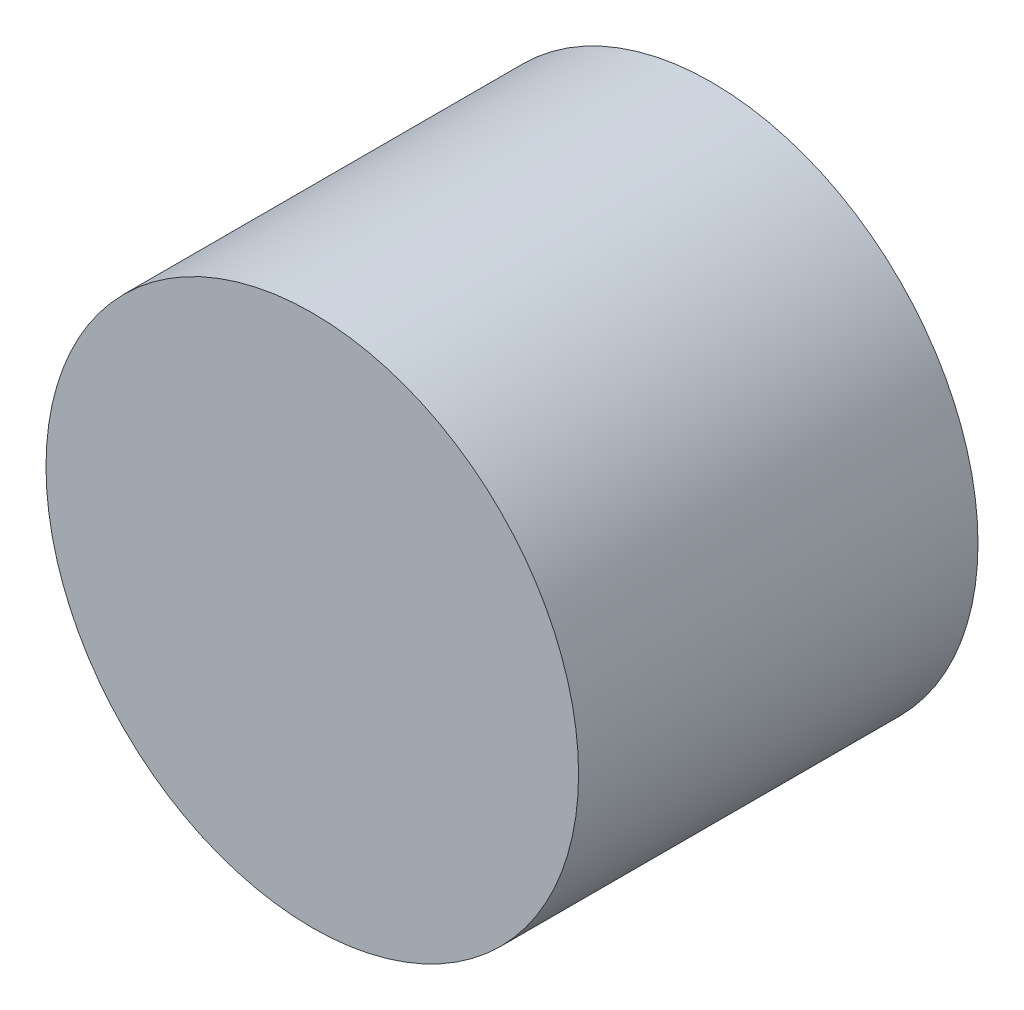
ISO-10303-21;
HEADER;
FILE_DESCRIPTION(('STEP AP214'),'2;1');
FILE_NAME('part.step','',(''),(''),'','','');
FILE_SCHEMA(('AUTOMOTIVE_DESIGN { 1 0 10303 214 1 1 1 1 }'));
ENDSEC;
DATA;
#1=APPLICATION_CONTEXT('core data for automotive mechanical design processes');
#2=APPLICATION_PROTOCOL_DEFINITION('international standard','automotive_design',2000,#1);
#3=PRODUCT_CONTEXT('',#1,'mechanical');
#4=PRODUCT('Part','Part','',(#3));
#5=PRODUCT_RELATED_PRODUCT_CATEGORY('part','',(#4));
#6=PRODUCT_DEFINITION_FORMATION('','',#4);
#7=PRODUCT_DEFINITION_CONTEXT('part definition',#1,'design');
#8=PRODUCT_DEFINITION('design','',#6,#7);
#9=PRODUCT_DEFINITION_SHAPE('','',#8);
#10=(LENGTH_UNIT() NAMED_UNIT(*) SI_UNIT(.MILLI.,.METRE.));
#11=(NAMED_UNIT(*) PLANE_ANGLE_UNIT() SI_UNIT($,.RADIAN.));
#12=(NAMED_UNIT(*) SI_UNIT($,.STERADIAN.) SOLID_ANGLE_UNIT());
#13=UNCERTAINTY_MEASURE_WITH_UNIT(LENGTH_MEASURE(1.E-05),#10,'distance_accuracy_value','');
#14=(GEOMETRIC_REPRESENTATION_CONTEXT(3) GLOBAL_UNCERTAINTY_ASSIGNED_CONTEXT((#13)) GLOBAL_UNIT_ASSIGNED_CONTEXT((#10,
#11,#12)) REPRESENTATION_CONTEXT('',''));
#15=CARTESIAN_POINT('',(0.,0.,0.));
#16=DIRECTION('',(0.,0.,1.));
#17=DIRECTION('',(1.,0.,0.));
#18=AXIS2_PLACEMENT_3D('',#15,#16,#17);
#19=CARTESIAN_POINT('',(0.,0.,76.2));
#20=DIRECTION('',(0.,0.,-1.));
#21=DIRECTION('',(-1.,0.,0.));
#22=AXIS2_PLACEMENT_3D('',#19,#20,#21);
#23=CYLINDRICAL_SURFACE('',#22,50.8);
#24=CARTESIAN_POINT('',(0.,0.,76.2));
#25=DIRECTION('',(0.,0.,1.));
#26=DIRECTION('',(1.,0.,0.));
#27=AXIS2_PLACEMENT_3D('',#24,#25,#26);
#28=CIRCLE('',#27,50.8);
#29=CARTESIAN_POINT('',(-50.8,0.,76.2));
#30=VERTEX_POINT('',#29);
#31=EDGE_CURVE('E10',#30,#30,#28,.T.);
#32=CARTESIAN_POINT('',(0.,0.,0.));
#33=DIRECTION('',(0.,0.,1.));
#34=DIRECTION('',(1.,0.,0.));
#35=AXIS2_PLACEMENT_3D('',#32,#33,#34);
#36=CIRCLE('',#35,50.8);
#37=CARTESIAN_POINT('',(-50.8,0.,0.));
#38=VERTEX_POINT('',#37);
#39=EDGE_CURVE('E34',#38,#38,#36,.T.);
#40=CARTESIAN_POINT('',(-50.8,0.,76.2));
#41=CARTESIAN_POINT('',(-50.8,0.,75.40625));
#42=CARTESIAN_POINT('',(-50.8,0.,74.6125));
#43=CARTESIAN_POINT('',(-50.8,0.,73.025));
#44=CARTESIAN_POINT('',(-50.8,0.,72.23125));
#45=CARTESIAN_POINT('',(-50.8,0.,70.64375));
#46=CARTESIAN_POINT('',(-50.8,0.,69.85));
#47=CARTESIAN_POINT('',(-50.8,0.,68.2625));
#48=CARTESIAN_POINT('',(-50.8,0.,67.46875));
#49=CARTESIAN_POINT('',(-50.8,0.,65.88125));
#50=CARTESIAN_POINT('',(-50.8,0.,65.0875));
#51=CARTESIAN_POINT('',(-50.8,0.,63.5));
#52=CARTESIAN_POINT('',(-50.8,0.,62.70625));
#53=CARTESIAN_POINT('',(-50.8,0.,61.11875));
#54=CARTESIAN_POINT('',(-50.8,0.,60.325));
#55=CARTESIAN_POINT('',(-50.8,0.,58.7375));
#56=CARTESIAN_POINT('',(-50.8,0.,57.94375));
#57=CARTESIAN_POINT('',(-50.8,0.,56.35625));
#58=CARTESIAN_POINT('',(-50.8,0.,55.5625));
#59=CARTESIAN_POINT('',(-50.8,0.,53.975));
#60=CARTESIAN_POINT('',(-50.8,0.,53.18125));
#61=CARTESIAN_POINT('',(-50.8,0.,51.59375));
#62=CARTESIAN_POINT('',(-50.8,0.,50.8));
#63=CARTESIAN_POINT('',(-50.8,0.,49.2125));
#64=CARTESIAN_POINT('',(-50.8,0.,48.41875));
#65=CARTESIAN_POINT('',(-50.8,0.,46.83125));
#66=CARTESIAN_POINT('',(-50.8,0.,46.0375));
#67=CARTESIAN_POINT('',(-50.8,0.,44.45));
#68=CARTESIAN_POINT('',(-50.8,0.,43.65625));
#69=CARTESIAN_POINT('',(-50.8,0.,42.06875));
#70=CARTESIAN_POINT('',(-50.8,0.,41.275));
#71=CARTESIAN_POINT('',(-50.8,0.,39.6875));
#72=CARTESIAN_POINT('',(-50.8,0.,38.89375));
#73=CARTESIAN_POINT('',(-50.8,0.,37.30625));
#74=CARTESIAN_POINT('',(-50.8,0.,36.5125));
#75=CARTESIAN_POINT('',(-50.8,0.,34.925));
#76=CARTESIAN_POINT('',(-50.8,0.,34.13125));
#77=CARTESIAN_POINT('',(-50.8,0.,32.54375));
#78=CARTESIAN_POINT('',(-50.8,0.,31.75));
#79=CARTESIAN_POINT('',(-50.8,0.,30.1625));
#80=CARTESIAN_POINT('',(-50.8,0.,29.36875));
#81=CARTESIAN_POINT('',(-50.8,0.,27.78125));
#82=CARTESIAN_POINT('',(-50.8,0.,26.9875));
#83=CARTESIAN_POINT('',(-50.8,0.,25.4));
#84=CARTESIAN_POINT('',(-50.8,0.,24.60625));
#85=CARTESIAN_POINT('',(-50.8,0.,23.01875));
#86=CARTESIAN_POINT('',(-50.8,0.,22.225));
#87=CARTESIAN_POINT('',(-50.8,0.,20.6375));
#88=CARTESIAN_POINT('',(-50.8,0.,19.84375));
#89=CARTESIAN_POINT('',(-50.8,0.,18.25625));
#90=CARTESIAN_POINT('',(-50.8,0.,17.4625));
#91=CARTESIAN_POINT('',(-50.8,0.,15.875));
#92=CARTESIAN_POINT('',(-50.8,0.,15.08125));
#93=CARTESIAN_POINT('',(-50.8,0.,13.49375));
#94=CARTESIAN_POINT('',(-50.8,0.,12.7));
#95=CARTESIAN_POINT('',(-50.8,0.,11.1125));
#96=CARTESIAN_POINT('',(-50.8,0.,10.31875));
#97=CARTESIAN_POINT('',(-50.8,0.,8.73125));
#98=CARTESIAN_POINT('',(-50.8,0.,7.93750000000001));
#99=CARTESIAN_POINT('',(-50.8,0.,6.35));
#100=CARTESIAN_POINT('',(-50.8,0.,5.55625));
#101=CARTESIAN_POINT('',(-50.8,0.,3.96875));
#102=CARTESIAN_POINT('',(-50.8,0.,3.175));
#103=CARTESIAN_POINT('',(-50.8,0.,1.5875));
#104=CARTESIAN_POINT('',(-50.8,0.,0.793750000000001));
#105=CARTESIAN_POINT('',(-50.8,0.,0.));
#106=B_SPLINE_CURVE_WITH_KNOTS('',3,(#40,#41,#42,#43,#44,#45,#46,#47,#48,#49,#50,#51,#52,#53,
#54,#55,#56,#57,#58,#59,#60,#61,#62,#63,#64,#65,#66,#67,#68,#69,#70,#71,#72,#73,#74,#75,#76,#77,
#78,#79,#80,#81,#82,#83,#84,#85,#86,#87,#88,#89,#90,#91,#92,#93,#94,#95,#96,#97,#98,#99,#100,
#101,#102,#103,#104,#105),.UNSPECIFIED.,.F.,.F.,(4,2,2,2,2,2,2,2,2,2,2,2,2,2,2,2,2,2,2,2,2,2,2,
2,2,2,2,2,2,2,2,2,4),(0.,2.38124999999999,4.76249999999999,7.14374999999999,9.52499999999999,
11.90625,14.2875,16.66875,19.05,21.43125,23.8125,26.19375,28.575,30.95625,33.3375,35.71875,38.1,
40.48125,42.8625,45.24375,47.625,50.00625,52.3875,54.76875,57.15,59.53125,61.9125,64.29375,
66.675,69.05625,71.4375,73.81875,76.2),.UNSPECIFIED.);
#107=EDGE_CURVE('BSEAM31',#30,#38,#106,.T.);
#108=ORIENTED_EDGE('',*,*,#31,.F.);
#109=ORIENTED_EDGE('',*,*,#39,.T.);
#110=ORIENTED_EDGE('',*,*,#107,.T.);
#111=ORIENTED_EDGE('',*,*,#107,.F.);
#112=EDGE_LOOP('',(#108,#110,#109,#111));
#113=FACE_BOUND('',#112,.T.);
#114=ADVANCED_FACE('F31',(#113),#23,.T.);
#115=CARTESIAN_POINT('',(0.,0.,76.2));
#116=DIRECTION('',(0.,0.,1.));
#117=DIRECTION('',(1.,0.,0.));
#118=AXIS2_PLACEMENT_3D('',#115,#116,#117);
#119=PLANE('',#118);
#120=ORIENTED_EDGE('',*,*,#31,.T.);
#121=EDGE_LOOP('',(#120));
#122=FACE_BOUND('',#121,.T.);
#123=ADVANCED_FACE('F46',(#122),#119,.T.);
#124=CARTESIAN_POINT('',(0.,0.,0.));
#125=DIRECTION('',(0.,0.,1.));
#126=DIRECTION('',(1.,0.,0.));
#127=AXIS2_PLACEMENT_3D('',#124,#125,#126);
#128=PLANE('',#127);
#129=ORIENTED_EDGE('',*,*,#39,.F.);
#130=EDGE_LOOP('',(#129));
#131=FACE_BOUND('',#130,.T.);
#132=ADVANCED_FACE('F44',(#131),#128,.F.);
#133=CLOSED_SHELL('',(#114,#123,#132));
#134=MANIFOLD_SOLID_BREP('B2',#133);
#135=ADVANCED_BREP_SHAPE_REPRESENTATION('',(#18,#134),#14);
#136=SHAPE_DEFINITION_REPRESENTATION(#9,#135);
ENDSEC;
END-ISO-10303-21;
